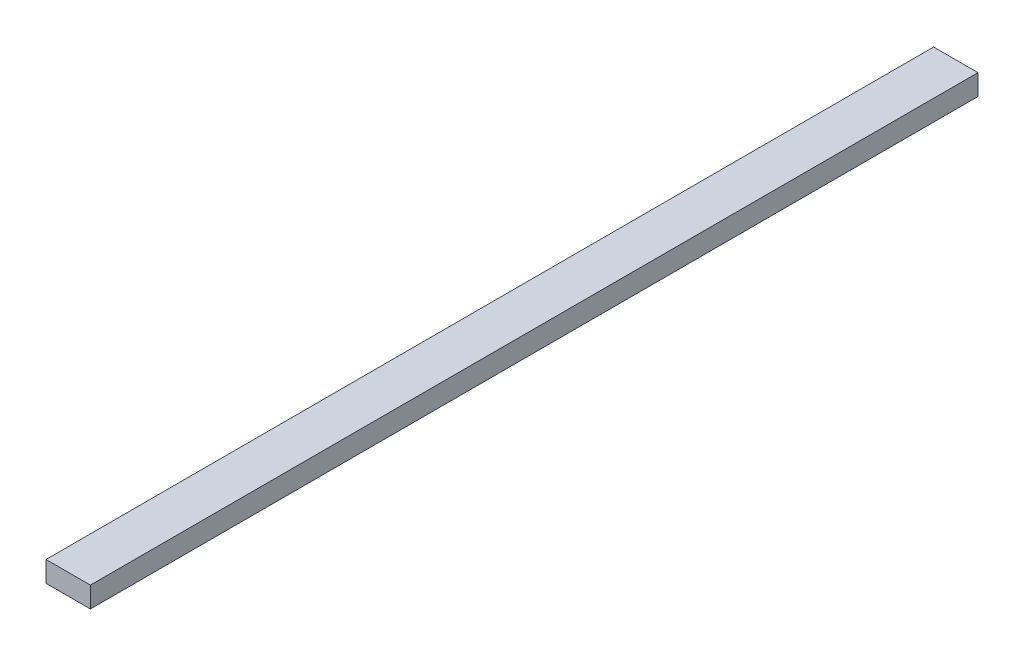
ISO-10303-21;
HEADER;
FILE_DESCRIPTION(('STEP AP214'),'2;1');
FILE_NAME('part.step','',(''),(''),'','','');
FILE_SCHEMA(('AUTOMOTIVE_DESIGN { 1 0 10303 214 1 1 1 1 }'));
ENDSEC;
DATA;
#1=APPLICATION_CONTEXT('core data for automotive mechanical design processes');
#2=APPLICATION_PROTOCOL_DEFINITION('international standard','automotive_design',2000,#1);
#3=PRODUCT_CONTEXT('',#1,'mechanical');
#4=PRODUCT('Part','Part','',(#3));
#5=PRODUCT_RELATED_PRODUCT_CATEGORY('part','',(#4));
#6=PRODUCT_DEFINITION_FORMATION('','',#4);
#7=PRODUCT_DEFINITION_CONTEXT('part definition',#1,'design');
#8=PRODUCT_DEFINITION('design','',#6,#7);
#9=PRODUCT_DEFINITION_SHAPE('','',#8);
#10=(LENGTH_UNIT() NAMED_UNIT(*) SI_UNIT(.MILLI.,.METRE.));
#11=(NAMED_UNIT(*) PLANE_ANGLE_UNIT() SI_UNIT($,.RADIAN.));
#12=(NAMED_UNIT(*) SI_UNIT($,.STERADIAN.) SOLID_ANGLE_UNIT());
#13=UNCERTAINTY_MEASURE_WITH_UNIT(LENGTH_MEASURE(1.E-05),#10,'distance_accuracy_value','');
#14=(GEOMETRIC_REPRESENTATION_CONTEXT(3) GLOBAL_UNCERTAINTY_ASSIGNED_CONTEXT((#13)) GLOBAL_UNIT_ASSIGNED_CONTEXT((#10,
#11,#12)) REPRESENTATION_CONTEXT('',''));
#15=CARTESIAN_POINT('',(0.,0.,0.));
#16=DIRECTION('',(0.,0.,1.));
#17=DIRECTION('',(1.,0.,0.));
#18=AXIS2_PLACEMENT_3D('',#15,#16,#17);
#19=CARTESIAN_POINT('',(0.,0.,300.));
#20=DIRECTION('',(1.,0.,0.));
#21=DIRECTION('',(0.,1.,0.));
#22=AXIS2_PLACEMENT_3D('',#19,#20,#21);
#23=PLANE('',#22);
#24=DIRECTION('',(0.,-1.,0.));
#25=VECTOR('',#24,1.);
#26=CARTESIAN_POINT('',(0.,0.,0.));
#27=LINE('',#26,#25);
#28=CARTESIAN_POINT('',(0.,7.,0.));
#29=VERTEX_POINT('',#28);
#30=CARTESIAN_POINT('',(0.,0.,0.));
#31=VERTEX_POINT('',#30);
#32=EDGE_CURVE('E107',#29,#31,#27,.T.);
#33=ORIENTED_EDGE('',*,*,#32,.T.);
#34=DIRECTION('',(0.,0.,-1.));
#35=VECTOR('',#34,1.);
#36=CARTESIAN_POINT('',(0.,0.,300.));
#37=LINE('',#36,#35);
#38=CARTESIAN_POINT('',(0.,0.,300.));
#39=VERTEX_POINT('',#38);
#40=EDGE_CURVE('E11',#39,#31,#37,.T.);
#41=ORIENTED_EDGE('',*,*,#40,.F.);
#42=DIRECTION('',(0.,-1.,0.));
#43=VECTOR('',#42,1.);
#44=CARTESIAN_POINT('',(0.,0.,300.));
#45=LINE('',#44,#43);
#46=CARTESIAN_POINT('',(0.,7.,300.));
#47=VERTEX_POINT('',#46);
#48=EDGE_CURVE('E91',#47,#39,#45,.T.);
#49=ORIENTED_EDGE('',*,*,#48,.F.);
#50=DIRECTION('',(0.,0.,-1.));
#51=VECTOR('',#50,1.);
#52=CARTESIAN_POINT('',(0.,7.,300.));
#53=LINE('',#52,#51);
#54=EDGE_CURVE('E103',#47,#29,#53,.T.);
#55=ORIENTED_EDGE('',*,*,#54,.T.);
#56=EDGE_LOOP('',(#33,#41,#49,#55));
#57=FACE_BOUND('',#56,.T.);
#58=ADVANCED_FACE('F39',(#57),#23,.F.);
#59=CARTESIAN_POINT('',(0.,0.,300.));
#60=DIRECTION('',(0.,1.,0.));
#61=DIRECTION('',(0.,0.,1.));
#62=AXIS2_PLACEMENT_3D('',#59,#60,#61);
#63=PLANE('',#62);
#64=DIRECTION('',(1.,0.,0.));
#65=VECTOR('',#64,1.);
#66=CARTESIAN_POINT('',(0.,0.,0.));
#67=LINE('',#66,#65);
#68=CARTESIAN_POINT('',(15.,0.,0.));
#69=VERTEX_POINT('',#68);
#70=EDGE_CURVE('E96',#31,#69,#67,.T.);
#71=ORIENTED_EDGE('',*,*,#70,.T.);
#72=DIRECTION('',(0.,0.,-1.));
#73=VECTOR('',#72,1.);
#74=CARTESIAN_POINT('',(15.,0.,300.));
#75=LINE('',#74,#73);
#76=CARTESIAN_POINT('',(15.,0.,300.));
#77=VERTEX_POINT('',#76);
#78=EDGE_CURVE('E48',#77,#69,#75,.T.);
#79=ORIENTED_EDGE('',*,*,#78,.F.);
#80=DIRECTION('',(1.,0.,0.));
#81=VECTOR('',#80,1.);
#82=CARTESIAN_POINT('',(0.,0.,300.));
#83=LINE('',#82,#81);
#84=EDGE_CURVE('E86',#39,#77,#83,.T.);
#85=ORIENTED_EDGE('',*,*,#84,.F.);
#86=ORIENTED_EDGE('',*,*,#40,.T.);
#87=EDGE_LOOP('',(#71,#79,#85,#86));
#88=FACE_BOUND('',#87,.T.);
#89=ADVANCED_FACE('F95',(#88),#63,.F.);
#90=CARTESIAN_POINT('',(15.,0.,300.));
#91=DIRECTION('',(-1.,0.,0.));
#92=DIRECTION('',(0.,-1.,0.));
#93=AXIS2_PLACEMENT_3D('',#90,#91,#92);
#94=PLANE('',#93);
#95=DIRECTION('',(0.,1.,0.));
#96=VECTOR('',#95,1.);
#97=CARTESIAN_POINT('',(15.,0.,0.));
#98=LINE('',#97,#96);
#99=CARTESIAN_POINT('',(15.,7.,0.));
#100=VERTEX_POINT('',#99);
#101=EDGE_CURVE('E73',#69,#100,#98,.T.);
#102=ORIENTED_EDGE('',*,*,#101,.T.);
#103=DIRECTION('',(0.,0.,-1.));
#104=VECTOR('',#103,1.);
#105=CARTESIAN_POINT('',(15.,7.,300.));
#106=LINE('',#105,#104);
#107=CARTESIAN_POINT('',(15.,7.,300.));
#108=VERTEX_POINT('',#107);
#109=EDGE_CURVE('E98',#108,#100,#106,.T.);
#110=ORIENTED_EDGE('',*,*,#109,.F.);
#111=DIRECTION('',(0.,1.,0.));
#112=VECTOR('',#111,1.);
#113=CARTESIAN_POINT('',(15.,0.,300.));
#114=LINE('',#113,#112);
#115=EDGE_CURVE('E89',#77,#108,#114,.T.);
#116=ORIENTED_EDGE('',*,*,#115,.F.);
#117=ORIENTED_EDGE('',*,*,#78,.T.);
#118=EDGE_LOOP('',(#102,#110,#116,#117));
#119=FACE_BOUND('',#118,.T.);
#120=ADVANCED_FACE('F99',(#119),#94,.F.);
#121=CARTESIAN_POINT('',(0.,7.,300.));
#122=DIRECTION('',(0.,-1.,0.));
#123=DIRECTION('',(0.,0.,-1.));
#124=AXIS2_PLACEMENT_3D('',#121,#122,#123);
#125=PLANE('',#124);
#126=DIRECTION('',(-1.,0.,0.));
#127=VECTOR('',#126,1.);
#128=CARTESIAN_POINT('',(0.,7.,0.));
#129=LINE('',#128,#127);
#130=EDGE_CURVE('E79',#100,#29,#129,.T.);
#131=ORIENTED_EDGE('',*,*,#130,.T.);
#132=ORIENTED_EDGE('',*,*,#54,.F.);
#133=DIRECTION('',(-1.,0.,0.));
#134=VECTOR('',#133,1.);
#135=CARTESIAN_POINT('',(0.,7.,300.));
#136=LINE('',#135,#134);
#137=EDGE_CURVE('E56',#108,#47,#136,.T.);
#138=ORIENTED_EDGE('',*,*,#137,.F.);
#139=ORIENTED_EDGE('',*,*,#109,.T.);
#140=EDGE_LOOP('',(#131,#132,#138,#139));
#141=FACE_BOUND('',#140,.T.);
#142=ADVANCED_FACE('F120',(#141),#125,.F.);
#143=CARTESIAN_POINT('',(0.,0.,300.));
#144=DIRECTION('',(0.,0.,-1.));
#145=DIRECTION('',(-1.,0.,0.));
#146=AXIS2_PLACEMENT_3D('',#143,#144,#145);
#147=PLANE('',#146);
#148=ORIENTED_EDGE('',*,*,#48,.T.);
#149=ORIENTED_EDGE('',*,*,#84,.T.);
#150=ORIENTED_EDGE('',*,*,#115,.T.);
#151=ORIENTED_EDGE('',*,*,#137,.T.);
#152=EDGE_LOOP('',(#148,#149,#150,#151));
#153=FACE_BOUND('',#152,.T.);
#154=ADVANCED_FACE('F87',(#153),#147,.F.);
#155=CARTESIAN_POINT('',(0.,0.,0.));
#156=DIRECTION('',(0.,0.,-1.));
#157=DIRECTION('',(-1.,0.,0.));
#158=AXIS2_PLACEMENT_3D('',#155,#156,#157);
#159=PLANE('',#158);
#160=ORIENTED_EDGE('',*,*,#32,.F.);
#161=ORIENTED_EDGE('',*,*,#130,.F.);
#162=ORIENTED_EDGE('',*,*,#101,.F.);
#163=ORIENTED_EDGE('',*,*,#70,.F.);
#164=EDGE_LOOP('',(#160,#161,#162,#163));
#165=FACE_BOUND('',#164,.T.);
#166=ADVANCED_FACE('F123',(#165),#159,.T.);
#167=CLOSED_SHELL('',(#58,#89,#120,#142,#154,#166));
#168=MANIFOLD_SOLID_BREP('B2',#167);
#169=ADVANCED_BREP_SHAPE_REPRESENTATION('',(#18,#168),#14);
#170=SHAPE_DEFINITION_REPRESENTATION(#9,#169);
ENDSEC;
END-ISO-10303-21;
